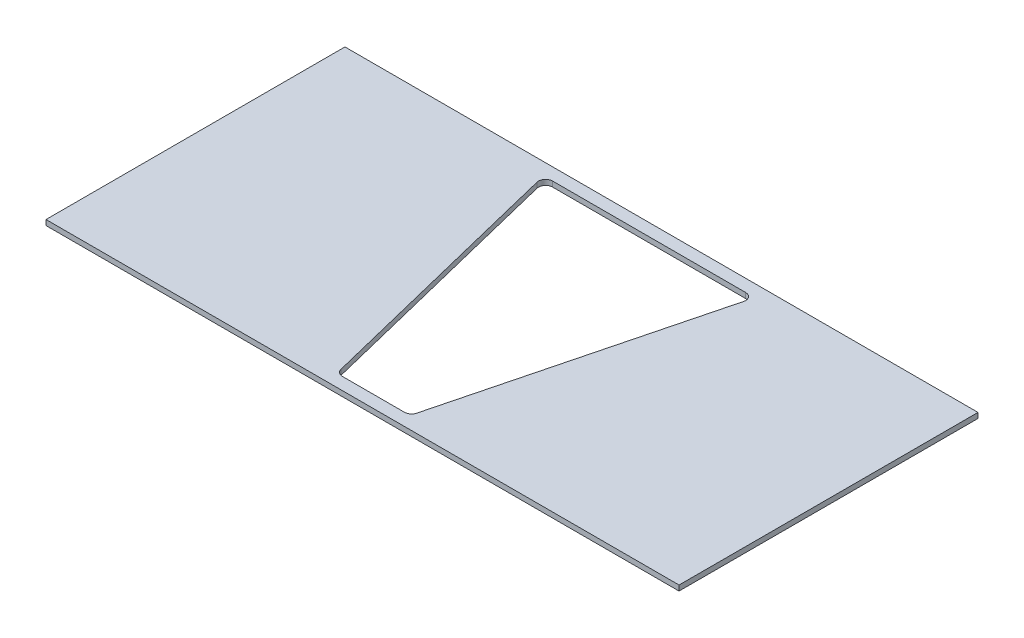
ISO-10303-21;
HEADER;
FILE_DESCRIPTION(('STEP AP214'),'2;1');
FILE_NAME('part.step','',(''),(''),'','','');
FILE_SCHEMA(('AUTOMOTIVE_DESIGN { 1 0 10303 214 1 1 1 1 }'));
ENDSEC;
DATA;
#1=APPLICATION_CONTEXT('core data for automotive mechanical design processes');
#2=APPLICATION_PROTOCOL_DEFINITION('international standard','automotive_design',2000,#1);
#3=PRODUCT_CONTEXT('',#1,'mechanical');
#4=PRODUCT('Part','Part','',(#3));
#5=PRODUCT_RELATED_PRODUCT_CATEGORY('part','',(#4));
#6=PRODUCT_DEFINITION_FORMATION('','',#4);
#7=PRODUCT_DEFINITION_CONTEXT('part definition',#1,'design');
#8=PRODUCT_DEFINITION('design','',#6,#7);
#9=PRODUCT_DEFINITION_SHAPE('','',#8);
#10=(LENGTH_UNIT() NAMED_UNIT(*) SI_UNIT(.MILLI.,.METRE.));
#11=(NAMED_UNIT(*) PLANE_ANGLE_UNIT() SI_UNIT($,.RADIAN.));
#12=(NAMED_UNIT(*) SI_UNIT($,.STERADIAN.) SOLID_ANGLE_UNIT());
#13=UNCERTAINTY_MEASURE_WITH_UNIT(LENGTH_MEASURE(1.E-05),#10,'distance_accuracy_value','');
#14=(GEOMETRIC_REPRESENTATION_CONTEXT(3) GLOBAL_UNCERTAINTY_ASSIGNED_CONTEXT((#13)) GLOBAL_UNIT_ASSIGNED_CONTEXT((#10,
#11,#12)) REPRESENTATION_CONTEXT('',''));
#15=CARTESIAN_POINT('',(0.,0.,0.));
#16=DIRECTION('',(0.,0.,1.));
#17=DIRECTION('',(1.,0.,0.));
#18=AXIS2_PLACEMENT_3D('',#15,#16,#17);
#19=CARTESIAN_POINT('',(-900.,7.5,425.));
#20=DIRECTION('',(1.,0.,0.));
#21=DIRECTION('',(0.,0.,-1.));
#22=AXIS2_PLACEMENT_3D('',#19,#20,#21);
#23=PLANE('',#22);
#24=DIRECTION('',(0.,0.,1.));
#25=VECTOR('',#24,1.);
#26=CARTESIAN_POINT('',(-900.,-7.5,425.));
#27=LINE('',#26,#25);
#28=CARTESIAN_POINT('',(-900.,-7.5,-425.));
#29=VERTEX_POINT('',#28);
#30=CARTESIAN_POINT('',(-900.,-7.5,425.));
#31=VERTEX_POINT('',#30);
#32=EDGE_CURVE('E145',#29,#31,#27,.T.);
#33=ORIENTED_EDGE('',*,*,#32,.T.);
#34=DIRECTION('',(0.,-1.,0.));
#35=VECTOR('',#34,1.);
#36=CARTESIAN_POINT('',(-900.,7.5,425.));
#37=LINE('',#36,#35);
#38=CARTESIAN_POINT('',(-900.,7.5,425.));
#39=VERTEX_POINT('',#38);
#40=EDGE_CURVE('E126',#39,#31,#37,.T.);
#41=ORIENTED_EDGE('',*,*,#40,.F.);
#42=DIRECTION('',(0.,0.,1.));
#43=VECTOR('',#42,1.);
#44=CARTESIAN_POINT('',(-900.,7.5,425.));
#45=LINE('',#44,#43);
#46=CARTESIAN_POINT('',(-900.,7.5,-425.));
#47=VERTEX_POINT('',#46);
#48=EDGE_CURVE('E133',#47,#39,#45,.T.);
#49=ORIENTED_EDGE('',*,*,#48,.F.);
#50=DIRECTION('',(0.,-1.,0.));
#51=VECTOR('',#50,1.);
#52=CARTESIAN_POINT('',(-900.,7.5,-425.));
#53=LINE('',#52,#51);
#54=EDGE_CURVE('E228',#47,#29,#53,.T.);
#55=ORIENTED_EDGE('',*,*,#54,.T.);
#56=EDGE_LOOP('',(#33,#41,#49,#55));
#57=FACE_BOUND('',#56,.T.);
#58=ADVANCED_FACE('F33',(#57),#23,.F.);
#59=CARTESIAN_POINT('',(900.,7.5,425.));
#60=DIRECTION('',(0.,0.,-1.));
#61=DIRECTION('',(-1.,0.,0.));
#62=AXIS2_PLACEMENT_3D('',#59,#60,#61);
#63=PLANE('',#62);
#64=DIRECTION('',(1.,0.,0.));
#65=VECTOR('',#64,1.);
#66=CARTESIAN_POINT('',(900.,-7.5,425.));
#67=LINE('',#66,#65);
#68=CARTESIAN_POINT('',(900.,-7.5,425.));
#69=VERTEX_POINT('',#68);
#70=EDGE_CURVE('E230',#31,#69,#67,.T.);
#71=ORIENTED_EDGE('',*,*,#70,.T.);
#72=DIRECTION('',(0.,-1.,0.));
#73=VECTOR('',#72,1.);
#74=CARTESIAN_POINT('',(900.,7.5,425.));
#75=LINE('',#74,#73);
#76=CARTESIAN_POINT('',(900.,7.5,425.));
#77=VERTEX_POINT('',#76);
#78=EDGE_CURVE('E129',#77,#69,#75,.T.);
#79=ORIENTED_EDGE('',*,*,#78,.F.);
#80=DIRECTION('',(1.,0.,0.));
#81=VECTOR('',#80,1.);
#82=CARTESIAN_POINT('',(900.,7.5,425.));
#83=LINE('',#82,#81);
#84=EDGE_CURVE('E122',#39,#77,#83,.T.);
#85=ORIENTED_EDGE('',*,*,#84,.F.);
#86=ORIENTED_EDGE('',*,*,#40,.T.);
#87=EDGE_LOOP('',(#71,#79,#85,#86));
#88=FACE_BOUND('',#87,.T.);
#89=ADVANCED_FACE('F124',(#88),#63,.F.);
#90=CARTESIAN_POINT('',(900.,7.5,425.));
#91=DIRECTION('',(-1.,0.,0.));
#92=DIRECTION('',(0.,0.,1.));
#93=AXIS2_PLACEMENT_3D('',#90,#91,#92);
#94=PLANE('',#93);
#95=DIRECTION('',(0.,0.,-1.));
#96=VECTOR('',#95,1.);
#97=CARTESIAN_POINT('',(900.,-7.5,425.));
#98=LINE('',#97,#96);
#99=CARTESIAN_POINT('',(900.,-7.5,-425.));
#100=VERTEX_POINT('',#99);
#101=EDGE_CURVE('E232',#69,#100,#98,.T.);
#102=ORIENTED_EDGE('',*,*,#101,.T.);
#103=DIRECTION('',(0.,-1.,0.));
#104=VECTOR('',#103,1.);
#105=CARTESIAN_POINT('',(900.,7.5,-425.));
#106=LINE('',#105,#104);
#107=CARTESIAN_POINT('',(900.,7.5,-425.));
#108=VERTEX_POINT('',#107);
#109=EDGE_CURVE('E151',#108,#100,#106,.T.);
#110=ORIENTED_EDGE('',*,*,#109,.F.);
#111=DIRECTION('',(0.,0.,-1.));
#112=VECTOR('',#111,1.);
#113=CARTESIAN_POINT('',(900.,7.5,425.));
#114=LINE('',#113,#112);
#115=EDGE_CURVE('E132',#77,#108,#114,.T.);
#116=ORIENTED_EDGE('',*,*,#115,.F.);
#117=ORIENTED_EDGE('',*,*,#78,.T.);
#118=EDGE_LOOP('',(#102,#110,#116,#117));
#119=FACE_BOUND('',#118,.T.);
#120=ADVANCED_FACE('F242',(#119),#94,.F.);
#121=CARTESIAN_POINT('',(900.,7.5,-425.));
#122=DIRECTION('',(0.,0.,1.));
#123=DIRECTION('',(1.,0.,0.));
#124=AXIS2_PLACEMENT_3D('',#121,#122,#123);
#125=PLANE('',#124);
#126=DIRECTION('',(-1.,0.,0.));
#127=VECTOR('',#126,1.);
#128=CARTESIAN_POINT('',(900.,-7.5,-425.));
#129=LINE('',#128,#127);
#130=EDGE_CURVE('E142',#100,#29,#129,.T.);
#131=ORIENTED_EDGE('',*,*,#130,.T.);
#132=ORIENTED_EDGE('',*,*,#54,.F.);
#133=DIRECTION('',(-1.,0.,0.));
#134=VECTOR('',#133,1.);
#135=CARTESIAN_POINT('',(900.,7.5,-425.));
#136=LINE('',#135,#134);
#137=EDGE_CURVE('E138',#108,#47,#136,.T.);
#138=ORIENTED_EDGE('',*,*,#137,.F.);
#139=ORIENTED_EDGE('',*,*,#109,.T.);
#140=EDGE_LOOP('',(#131,#132,#138,#139));
#141=FACE_BOUND('',#140,.T.);
#142=ADVANCED_FACE('F239',(#141),#125,.F.);
#143=CARTESIAN_POINT('',(0.,7.5,0.));
#144=DIRECTION('',(0.,1.,0.));
#145=DIRECTION('',(0.,0.,1.));
#146=AXIS2_PLACEMENT_3D('',#143,#144,#145);
#147=PLANE('',#146);
#148=DIRECTION('',(0.239019047122404,0.,0.971014878934766));
#149=VECTOR('',#148,1.);
#150=CARTESIAN_POINT('',(-108.,7.5,390.));
#151=LINE('',#150,#149);
#152=CARTESIAN_POINT('',(-293.900213921859,7.5,-365.219619057552));
#153=VERTEX_POINT('',#152);
#154=CARTESIAN_POINT('',(-111.746367768013,7.5,374.780380942448));
#155=VERTEX_POINT('',#154);
#156=EDGE_CURVE('E218',#153,#155,#151,.T.);
#157=ORIENTED_EDGE('',*,*,#156,.F.);
#158=CARTESIAN_POINT('',(-274.479916343164,7.50000000000001,-370.));
#159=DIRECTION('',(0.,1.,0.));
#160=DIRECTION('',(0.,0.,1.));
#161=AXIS2_PLACEMENT_3D('',#158,#159,#160);
#162=CIRCLE('',#161,20.);
#163=CARTESIAN_POINT('',(-274.479916343164,7.5,-390.));
#164=VERTEX_POINT('',#163);
#165=EDGE_CURVE('E188',#153,#164,#162,.F.);
#166=ORIENTED_EDGE('',*,*,#165,.T.);
#167=DIRECTION('',(-1.,0.,0.));
#168=VECTOR('',#167,1.);
#169=CARTESIAN_POINT('',(-300.,7.5,-390.));
#170=LINE('',#169,#168);
#171=CARTESIAN_POINT('',(274.224797805951,7.5,-390.));
#172=VERTEX_POINT('',#171);
#173=EDGE_CURVE('E197',#172,#164,#170,.T.);
#174=ORIENTED_EDGE('',*,*,#173,.F.);
#175=CARTESIAN_POINT('',(274.224797805951,7.50000000000001,-370.));
#176=DIRECTION('',(0.,1.,0.));
#177=DIRECTION('',(0.,0.,1.));
#178=AXIS2_PLACEMENT_3D('',#175,#176,#177);
#179=CIRCLE('',#178,20.);
#180=CARTESIAN_POINT('',(293.598075126832,7.5,-365.032492994646));
#181=VERTEX_POINT('',#180);
#182=EDGE_CURVE('E41',#172,#181,#179,.F.);
#183=ORIENTED_EDGE('',*,*,#182,.T.);
#184=DIRECTION('',(0.248375350267704,0.,-0.968663866044045));
#185=VECTOR('',#184,1.);
#186=CARTESIAN_POINT('',(300.,7.5,-390.));
#187=LINE('',#186,#185);
#188=CARTESIAN_POINT('',(103.854485383243,7.5,374.967507005354));
#189=VERTEX_POINT('',#188);
#190=EDGE_CURVE('E196',#189,#181,#187,.T.);
#191=ORIENTED_EDGE('',*,*,#190,.F.);
#192=CARTESIAN_POINT('',(84.4812080623616,7.50000000000001,370.));
#193=DIRECTION('',(0.,1.,0.));
#194=DIRECTION('',(0.,0.,1.));
#195=AXIS2_PLACEMENT_3D('',#192,#193,#194);
#196=CIRCLE('',#195,20.);
#197=CARTESIAN_POINT('',(84.4812080623616,7.5,390.));
#198=VERTEX_POINT('',#197);
#199=EDGE_CURVE('E184',#189,#198,#196,.F.);
#200=ORIENTED_EDGE('',*,*,#199,.T.);
#201=DIRECTION('',(1.,0.,0.));
#202=VECTOR('',#201,1.);
#203=CARTESIAN_POINT('',(100.,7.5,390.));
#204=LINE('',#203,#202);
#205=CARTESIAN_POINT('',(-92.3260701893175,7.5,390.));
#206=VERTEX_POINT('',#205);
#207=EDGE_CURVE('E205',#206,#198,#204,.T.);
#208=ORIENTED_EDGE('',*,*,#207,.F.);
#209=CARTESIAN_POINT('',(-92.3260701893175,7.50000000000001,370.));
#210=DIRECTION('',(0.,1.,0.));
#211=DIRECTION('',(0.,0.,1.));
#212=AXIS2_PLACEMENT_3D('',#209,#210,#211);
#213=CIRCLE('',#212,20.);
#214=EDGE_CURVE('E180',#206,#155,#213,.F.);
#215=ORIENTED_EDGE('',*,*,#214,.T.);
#216=EDGE_LOOP('',(#157,#166,#174,#183,#191,#200,#208,#215));
#217=FACE_BOUND('',#216,.T.);
#218=ORIENTED_EDGE('',*,*,#48,.T.);
#219=ORIENTED_EDGE('',*,*,#84,.T.);
#220=ORIENTED_EDGE('',*,*,#115,.T.);
#221=ORIENTED_EDGE('',*,*,#137,.T.);
#222=EDGE_LOOP('',(#218,#219,#220,#221));
#223=FACE_BOUND('',#222,.T.);
#224=ADVANCED_FACE('F136',(#217,#223),#147,.T.);
#225=CARTESIAN_POINT('',(0.,-7.5,0.));
#226=DIRECTION('',(0.,1.,0.));
#227=DIRECTION('',(0.,0.,1.));
#228=AXIS2_PLACEMENT_3D('',#225,#226,#227);
#229=PLANE('',#228);
#230=DIRECTION('',(0.248375350267704,0.,-0.968663866044045));
#231=VECTOR('',#230,1.);
#232=CARTESIAN_POINT('',(187.661937075879,-7.5,48.1184454040715));
#233=LINE('',#232,#231);
#234=CARTESIAN_POINT('',(103.854485383243,-7.5,374.967507005354));
#235=VERTEX_POINT('',#234);
#236=CARTESIAN_POINT('',(293.598075126832,-7.5,-365.032492994646));
#237=VERTEX_POINT('',#236);
#238=EDGE_CURVE('E149',#235,#237,#233,.T.);
#239=ORIENTED_EDGE('',*,*,#238,.T.);
#240=CARTESIAN_POINT('',(274.224797805951,-7.50000000000001,-370.));
#241=DIRECTION('',(0.,1.,0.));
#242=DIRECTION('',(0.,0.,1.));
#243=AXIS2_PLACEMENT_3D('',#240,#241,#242);
#244=CIRCLE('',#243,20.);
#245=CARTESIAN_POINT('',(274.224797805951,-7.5,-390.));
#246=VERTEX_POINT('',#245);
#247=EDGE_CURVE('E11',#237,#246,#244,.T.);
#248=ORIENTED_EDGE('',*,*,#247,.T.);
#249=DIRECTION('',(-1.,0.,0.));
#250=VECTOR('',#249,1.);
#251=CARTESIAN_POINT('',(0.,-7.5,-390.));
#252=LINE('',#251,#250);
#253=CARTESIAN_POINT('',(-274.479916343164,-7.5,-390.));
#254=VERTEX_POINT('',#253);
#255=EDGE_CURVE('E156',#246,#254,#252,.T.);
#256=ORIENTED_EDGE('',*,*,#255,.T.);
#257=CARTESIAN_POINT('',(-274.479916343164,-7.50000000000001,-370.));
#258=DIRECTION('',(0.,1.,0.));
#259=DIRECTION('',(0.,0.,1.));
#260=AXIS2_PLACEMENT_3D('',#257,#258,#259);
#261=CIRCLE('',#260,20.);
#262=CARTESIAN_POINT('',(-293.900213921859,-7.5,-365.219619057552));
#263=VERTEX_POINT('',#262);
#264=EDGE_CURVE('E190',#254,#263,#261,.T.);
#265=ORIENTED_EDGE('',*,*,#264,.T.);
#266=DIRECTION('',(0.239019047122404,0.,0.971014878934766));
#267=VECTOR('',#266,1.);
#268=CARTESIAN_POINT('',(-192.34545860299,-7.5,47.3465744253515));
#269=LINE('',#268,#267);
#270=CARTESIAN_POINT('',(-111.746367768013,-7.5,374.780380942448));
#271=VERTEX_POINT('',#270);
#272=EDGE_CURVE('E158',#263,#271,#269,.T.);
#273=ORIENTED_EDGE('',*,*,#272,.T.);
#274=CARTESIAN_POINT('',(-92.3260701893175,-7.50000000000001,370.));
#275=DIRECTION('',(0.,1.,0.));
#276=DIRECTION('',(0.,0.,1.));
#277=AXIS2_PLACEMENT_3D('',#274,#275,#276);
#278=CIRCLE('',#277,20.);
#279=CARTESIAN_POINT('',(-92.3260701893175,-7.5,390.));
#280=VERTEX_POINT('',#279);
#281=EDGE_CURVE('E182',#271,#280,#278,.T.);
#282=ORIENTED_EDGE('',*,*,#281,.T.);
#283=DIRECTION('',(1.,0.,0.));
#284=VECTOR('',#283,1.);
#285=CARTESIAN_POINT('',(1.04083408558608E-13,-7.5,390.));
#286=LINE('',#285,#284);
#287=CARTESIAN_POINT('',(84.4812080623616,-7.5,390.));
#288=VERTEX_POINT('',#287);
#289=EDGE_CURVE('E146',#280,#288,#286,.T.);
#290=ORIENTED_EDGE('',*,*,#289,.T.);
#291=CARTESIAN_POINT('',(84.4812080623616,-7.50000000000001,370.));
#292=DIRECTION('',(0.,1.,0.));
#293=DIRECTION('',(0.,0.,1.));
#294=AXIS2_PLACEMENT_3D('',#291,#292,#293);
#295=CIRCLE('',#294,20.);
#296=EDGE_CURVE('E186',#288,#235,#295,.T.);
#297=ORIENTED_EDGE('',*,*,#296,.T.);
#298=EDGE_LOOP('',(#239,#248,#256,#265,#273,#282,#290,#297));
#299=FACE_BOUND('',#298,.T.);
#300=ORIENTED_EDGE('',*,*,#32,.F.);
#301=ORIENTED_EDGE('',*,*,#130,.F.);
#302=ORIENTED_EDGE('',*,*,#101,.F.);
#303=ORIENTED_EDGE('',*,*,#70,.F.);
#304=EDGE_LOOP('',(#300,#301,#302,#303));
#305=FACE_BOUND('',#304,.T.);
#306=ADVANCED_FACE('F209',(#299,#305),#229,.F.);
#307=CARTESIAN_POINT('',(-108.,-472.5,390.));
#308=DIRECTION('',(-0.971014878934766,0.,0.239019047122404));
#309=DIRECTION('',(0.239019047122404,0.,0.971014878934766));
#310=AXIS2_PLACEMENT_3D('',#307,#308,#309);
#311=PLANE('',#310);
#312=ORIENTED_EDGE('',*,*,#156,.T.);
#313=DIRECTION('',(0.,1.,0.));
#314=VECTOR('',#313,1.);
#315=CARTESIAN_POINT('',(-111.746367768013,-7.50000000000012,374.780380942448));
#316=LINE('',#315,#314);
#317=EDGE_CURVE('E169',#155,#271,#316,.F.);
#318=ORIENTED_EDGE('',*,*,#317,.T.);
#319=ORIENTED_EDGE('',*,*,#272,.F.);
#320=DIRECTION('',(0.,1.,0.));
#321=VECTOR('',#320,1.);
#322=CARTESIAN_POINT('',(-293.900213921859,7.50000000000001,-365.219619057552));
#323=LINE('',#322,#321);
#324=EDGE_CURVE('E166',#263,#153,#323,.T.);
#325=ORIENTED_EDGE('',*,*,#324,.T.);
#326=EDGE_LOOP('',(#312,#318,#319,#325));
#327=FACE_BOUND('',#326,.T.);
#328=ADVANCED_FACE('F217',(#327),#311,.F.);
#329=CARTESIAN_POINT('',(-300.,-472.5,-390.));
#330=DIRECTION('',(0.,0.,-1.));
#331=DIRECTION('',(-1.,0.,0.));
#332=AXIS2_PLACEMENT_3D('',#329,#330,#331);
#333=PLANE('',#332);
#334=ORIENTED_EDGE('',*,*,#173,.T.);
#335=DIRECTION('',(0.,1.,0.));
#336=VECTOR('',#335,1.);
#337=CARTESIAN_POINT('',(-274.479916343164,-7.50000000000012,-390.));
#338=LINE('',#337,#336);
#339=EDGE_CURVE('E48',#164,#254,#338,.F.);
#340=ORIENTED_EDGE('',*,*,#339,.T.);
#341=ORIENTED_EDGE('',*,*,#255,.F.);
#342=DIRECTION('',(0.,1.,0.));
#343=VECTOR('',#342,1.);
#344=CARTESIAN_POINT('',(274.224797805951,7.50000000000001,-390.));
#345=LINE('',#344,#343);
#346=EDGE_CURVE('E176',#246,#172,#345,.T.);
#347=ORIENTED_EDGE('',*,*,#346,.T.);
#348=EDGE_LOOP('',(#334,#340,#341,#347));
#349=FACE_BOUND('',#348,.T.);
#350=ADVANCED_FACE('F207',(#349),#333,.F.);
#351=CARTESIAN_POINT('',(300.,-472.5,-390.));
#352=DIRECTION('',(0.968663866044045,0.,0.248375350267704));
#353=DIRECTION('',(0.248375350267704,0.,-0.968663866044045));
#354=AXIS2_PLACEMENT_3D('',#351,#352,#353);
#355=PLANE('',#354);
#356=ORIENTED_EDGE('',*,*,#238,.F.);
#357=DIRECTION('',(0.,1.,0.));
#358=VECTOR('',#357,1.);
#359=CARTESIAN_POINT('',(103.854485383243,7.4999999999999,374.967507005354));
#360=LINE('',#359,#358);
#361=EDGE_CURVE('E173',#235,#189,#360,.T.);
#362=ORIENTED_EDGE('',*,*,#361,.T.);
#363=ORIENTED_EDGE('',*,*,#190,.T.);
#364=DIRECTION('',(0.,1.,0.));
#365=VECTOR('',#364,1.);
#366=CARTESIAN_POINT('',(293.598075126832,-7.50000000000012,-365.032492994646));
#367=LINE('',#366,#365);
#368=EDGE_CURVE('E171',#181,#237,#367,.F.);
#369=ORIENTED_EDGE('',*,*,#368,.T.);
#370=EDGE_LOOP('',(#356,#362,#363,#369));
#371=FACE_BOUND('',#370,.T.);
#372=ADVANCED_FACE('F203',(#371),#355,.F.);
#373=CARTESIAN_POINT('',(100.,-472.5,390.));
#374=DIRECTION('',(0.,0.,1.));
#375=DIRECTION('',(1.,0.,0.));
#376=AXIS2_PLACEMENT_3D('',#373,#374,#375);
#377=PLANE('',#376);
#378=ORIENTED_EDGE('',*,*,#289,.F.);
#379=DIRECTION('',(0.,1.,0.));
#380=VECTOR('',#379,1.);
#381=CARTESIAN_POINT('',(-92.3260701893175,7.50000000000001,390.));
#382=LINE('',#381,#380);
#383=EDGE_CURVE('E163',#280,#206,#382,.T.);
#384=ORIENTED_EDGE('',*,*,#383,.T.);
#385=ORIENTED_EDGE('',*,*,#207,.T.);
#386=DIRECTION('',(0.,1.,0.));
#387=VECTOR('',#386,1.);
#388=CARTESIAN_POINT('',(84.4812080623616,-7.50000000000012,390.));
#389=LINE('',#388,#387);
#390=EDGE_CURVE('E161',#198,#288,#389,.F.);
#391=ORIENTED_EDGE('',*,*,#390,.T.);
#392=EDGE_LOOP('',(#378,#384,#385,#391));
#393=FACE_BOUND('',#392,.T.);
#394=ADVANCED_FACE('F260',(#393),#377,.F.);
#395=CARTESIAN_POINT('',(-92.3260701893175,-472.5,370.));
#396=DIRECTION('',(0.,-1.,0.));
#397=DIRECTION('',(0.,0.,-1.));
#398=AXIS2_PLACEMENT_3D('',#395,#396,#397);
#399=CYLINDRICAL_SURFACE('',#398,20.);
#400=ORIENTED_EDGE('',*,*,#281,.F.);
#401=ORIENTED_EDGE('',*,*,#317,.F.);
#402=ORIENTED_EDGE('',*,*,#214,.F.);
#403=ORIENTED_EDGE('',*,*,#383,.F.);
#404=EDGE_LOOP('',(#400,#401,#402,#403));
#405=FACE_BOUND('',#404,.T.);
#406=ADVANCED_FACE('F256',(#405),#399,.F.);
#407=CARTESIAN_POINT('',(84.4812080623616,-472.5,370.));
#408=DIRECTION('',(0.,-1.,0.));
#409=DIRECTION('',(0.,0.,-1.));
#410=AXIS2_PLACEMENT_3D('',#407,#408,#409);
#411=CYLINDRICAL_SURFACE('',#410,20.);
#412=ORIENTED_EDGE('',*,*,#296,.F.);
#413=ORIENTED_EDGE('',*,*,#390,.F.);
#414=ORIENTED_EDGE('',*,*,#199,.F.);
#415=ORIENTED_EDGE('',*,*,#361,.F.);
#416=EDGE_LOOP('',(#412,#413,#414,#415));
#417=FACE_BOUND('',#416,.T.);
#418=ADVANCED_FACE('F259',(#417),#411,.F.);
#419=CARTESIAN_POINT('',(-274.479916343164,-472.5,-370.));
#420=DIRECTION('',(0.,-1.,0.));
#421=DIRECTION('',(0.,0.,-1.));
#422=AXIS2_PLACEMENT_3D('',#419,#420,#421);
#423=CYLINDRICAL_SURFACE('',#422,20.);
#424=ORIENTED_EDGE('',*,*,#264,.F.);
#425=ORIENTED_EDGE('',*,*,#339,.F.);
#426=ORIENTED_EDGE('',*,*,#165,.F.);
#427=ORIENTED_EDGE('',*,*,#324,.F.);
#428=EDGE_LOOP('',(#424,#425,#426,#427));
#429=FACE_BOUND('',#428,.T.);
#430=ADVANCED_FACE('F214',(#429),#423,.F.);
#431=CARTESIAN_POINT('',(274.224797805951,-472.5,-370.));
#432=DIRECTION('',(0.,-1.,0.));
#433=DIRECTION('',(0.,0.,-1.));
#434=AXIS2_PLACEMENT_3D('',#431,#432,#433);
#435=CYLINDRICAL_SURFACE('',#434,20.);
#436=ORIENTED_EDGE('',*,*,#247,.F.);
#437=ORIENTED_EDGE('',*,*,#368,.F.);
#438=ORIENTED_EDGE('',*,*,#182,.F.);
#439=ORIENTED_EDGE('',*,*,#346,.F.);
#440=EDGE_LOOP('',(#436,#437,#438,#439));
#441=FACE_BOUND('',#440,.T.);
#442=ADVANCED_FACE('F35',(#441),#435,.F.);
#443=CLOSED_SHELL('',(#58,#89,#120,#142,#224,#306,#328,#350,#372,#394,#406,#418,#430,#442));
#444=MANIFOLD_SOLID_BREP('B2',#443);
#445=ADVANCED_BREP_SHAPE_REPRESENTATION('',(#18,#444),#14);
#446=SHAPE_DEFINITION_REPRESENTATION(#9,#445);
ENDSEC;
END-ISO-10303-21;
